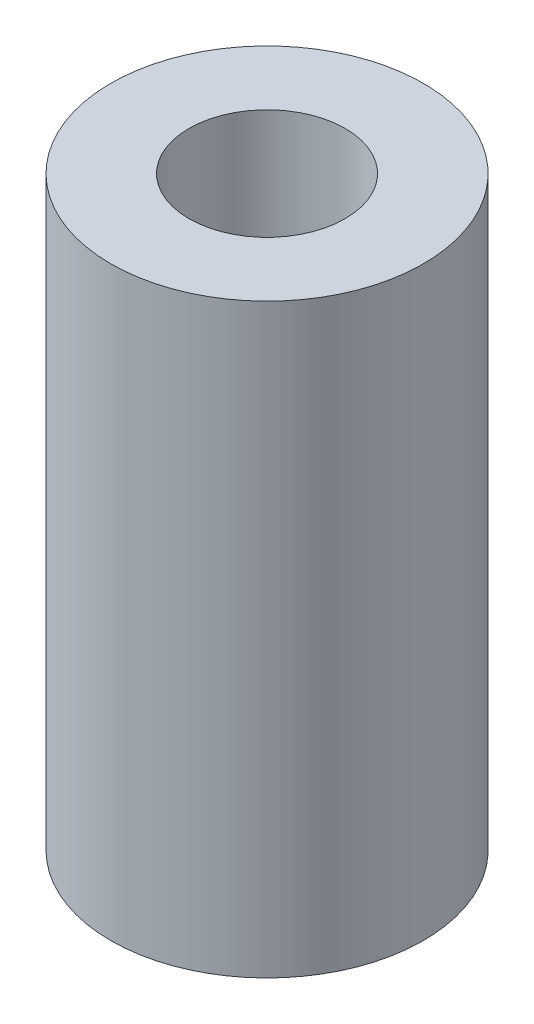
ISO-10303-21;
HEADER;
FILE_DESCRIPTION(('STEP AP214'),'2;1');
FILE_NAME('part.step','',(''),(''),'','','');
FILE_SCHEMA(('AUTOMOTIVE_DESIGN { 1 0 10303 214 1 1 1 1 }'));
ENDSEC;
DATA;
#1=APPLICATION_CONTEXT('core data for automotive mechanical design processes');
#2=APPLICATION_PROTOCOL_DEFINITION('international standard','automotive_design',2000,#1);
#3=PRODUCT_CONTEXT('',#1,'mechanical');
#4=PRODUCT('Part','Part','',(#3));
#5=PRODUCT_RELATED_PRODUCT_CATEGORY('part','',(#4));
#6=PRODUCT_DEFINITION_FORMATION('','',#4);
#7=PRODUCT_DEFINITION_CONTEXT('part definition',#1,'design');
#8=PRODUCT_DEFINITION('design','',#6,#7);
#9=PRODUCT_DEFINITION_SHAPE('','',#8);
#10=(LENGTH_UNIT() NAMED_UNIT(*) SI_UNIT(.MILLI.,.METRE.));
#11=(NAMED_UNIT(*) PLANE_ANGLE_UNIT() SI_UNIT($,.RADIAN.));
#12=(NAMED_UNIT(*) SI_UNIT($,.STERADIAN.) SOLID_ANGLE_UNIT());
#13=UNCERTAINTY_MEASURE_WITH_UNIT(LENGTH_MEASURE(1.E-05),#10,'distance_accuracy_value','');
#14=(GEOMETRIC_REPRESENTATION_CONTEXT(3) GLOBAL_UNCERTAINTY_ASSIGNED_CONTEXT((#13)) GLOBAL_UNIT_ASSIGNED_CONTEXT((#10,
#11,#12)) REPRESENTATION_CONTEXT('',''));
#15=CARTESIAN_POINT('',(0.,0.,0.));
#16=DIRECTION('',(0.,0.,1.));
#17=DIRECTION('',(1.,0.,0.));
#18=AXIS2_PLACEMENT_3D('',#15,#16,#17);
#19=CARTESIAN_POINT('',(0.,15.,0.));
#20=DIRECTION('',(0.,1.,0.));
#21=DIRECTION('',(0.,0.,1.));
#22=AXIS2_PLACEMENT_3D('',#19,#20,#21);
#23=PLANE('',#22);
#24=CARTESIAN_POINT('',(0.,15.,0.));
#25=DIRECTION('',(0.,1.,0.));
#26=DIRECTION('',(0.,0.,1.));
#27=AXIS2_PLACEMENT_3D('',#24,#25,#26);
#28=CIRCLE('',#27,4.);
#29=CARTESIAN_POINT('',(0.,15.,4.));
#30=VERTEX_POINT('',#29);
#31=EDGE_CURVE('E10',#30,#30,#28,.T.);
#32=ORIENTED_EDGE('',*,*,#31,.T.);
#33=EDGE_LOOP('',(#32));
#34=FACE_BOUND('',#33,.T.);
#35=CARTESIAN_POINT('',(0.,15.,0.));
#36=DIRECTION('',(0.,1.,0.));
#37=DIRECTION('',(0.,0.,1.));
#38=AXIS2_PLACEMENT_3D('',#35,#36,#37);
#39=CIRCLE('',#38,2.);
#40=CARTESIAN_POINT('',(0.,15.,2.));
#41=VERTEX_POINT('',#40);
#42=EDGE_CURVE('E42',#41,#41,#39,.T.);
#43=ORIENTED_EDGE('',*,*,#42,.F.);
#44=EDGE_LOOP('',(#43));
#45=FACE_BOUND('',#44,.T.);
#46=ADVANCED_FACE('F31',(#34,#45),#23,.T.);
#47=CARTESIAN_POINT('',(0.,0.,0.));
#48=DIRECTION('',(0.,1.,0.));
#49=DIRECTION('',(0.,0.,1.));
#50=AXIS2_PLACEMENT_3D('',#47,#48,#49);
#51=PLANE('',#50);
#52=CARTESIAN_POINT('',(0.,0.,0.));
#53=DIRECTION('',(0.,1.,0.));
#54=DIRECTION('',(0.,0.,1.));
#55=AXIS2_PLACEMENT_3D('',#52,#53,#54);
#56=CIRCLE('',#55,4.);
#57=CARTESIAN_POINT('',(0.,0.,4.));
#58=VERTEX_POINT('',#57);
#59=EDGE_CURVE('E35',#58,#58,#56,.T.);
#60=ORIENTED_EDGE('',*,*,#59,.F.);
#61=EDGE_LOOP('',(#60));
#62=FACE_BOUND('',#61,.T.);
#63=CARTESIAN_POINT('',(0.,0.,0.));
#64=DIRECTION('',(0.,1.,0.));
#65=DIRECTION('',(0.,0.,1.));
#66=AXIS2_PLACEMENT_3D('',#63,#64,#65);
#67=CIRCLE('',#66,2.);
#68=CARTESIAN_POINT('',(0.,0.,2.));
#69=VERTEX_POINT('',#68);
#70=EDGE_CURVE('E44',#69,#69,#67,.T.);
#71=ORIENTED_EDGE('',*,*,#70,.T.);
#72=EDGE_LOOP('',(#71));
#73=FACE_BOUND('',#72,.T.);
#74=ADVANCED_FACE('F54',(#62,#73),#51,.F.);
#75=CARTESIAN_POINT('',(0.,15.,0.));
#76=DIRECTION('',(0.,-1.,0.));
#77=DIRECTION('',(0.,0.,-1.));
#78=AXIS2_PLACEMENT_3D('',#75,#76,#77);
#79=CYLINDRICAL_SURFACE('',#78,4.);
#80=ORIENTED_EDGE('',*,*,#31,.F.);
#81=EDGE_LOOP('',(#80));
#82=FACE_BOUND('',#81,.T.);
#83=ORIENTED_EDGE('',*,*,#59,.T.);
#84=EDGE_LOOP('',(#83));
#85=FACE_BOUND('',#84,.T.);
#86=ADVANCED_FACE('F33',(#82,#85),#79,.T.);
#87=CARTESIAN_POINT('',(0.,15.,0.));
#88=DIRECTION('',(0.,-1.,0.));
#89=DIRECTION('',(0.,0.,-1.));
#90=AXIS2_PLACEMENT_3D('',#87,#88,#89);
#91=CYLINDRICAL_SURFACE('',#90,2.);
#92=ORIENTED_EDGE('',*,*,#42,.T.);
#93=EDGE_LOOP('',(#92));
#94=FACE_BOUND('',#93,.T.);
#95=ORIENTED_EDGE('',*,*,#70,.F.);
#96=EDGE_LOOP('',(#95));
#97=FACE_BOUND('',#96,.T.);
#98=ADVANCED_FACE('F50',(#94,#97),#91,.F.);
#99=CLOSED_SHELL('',(#46,#74,#86,#98));
#100=MANIFOLD_SOLID_BREP('B2',#99);
#101=ADVANCED_BREP_SHAPE_REPRESENTATION('',(#18,#100),#14);
#102=SHAPE_DEFINITION_REPRESENTATION(#9,#101);
ENDSEC;
END-ISO-10303-21;
